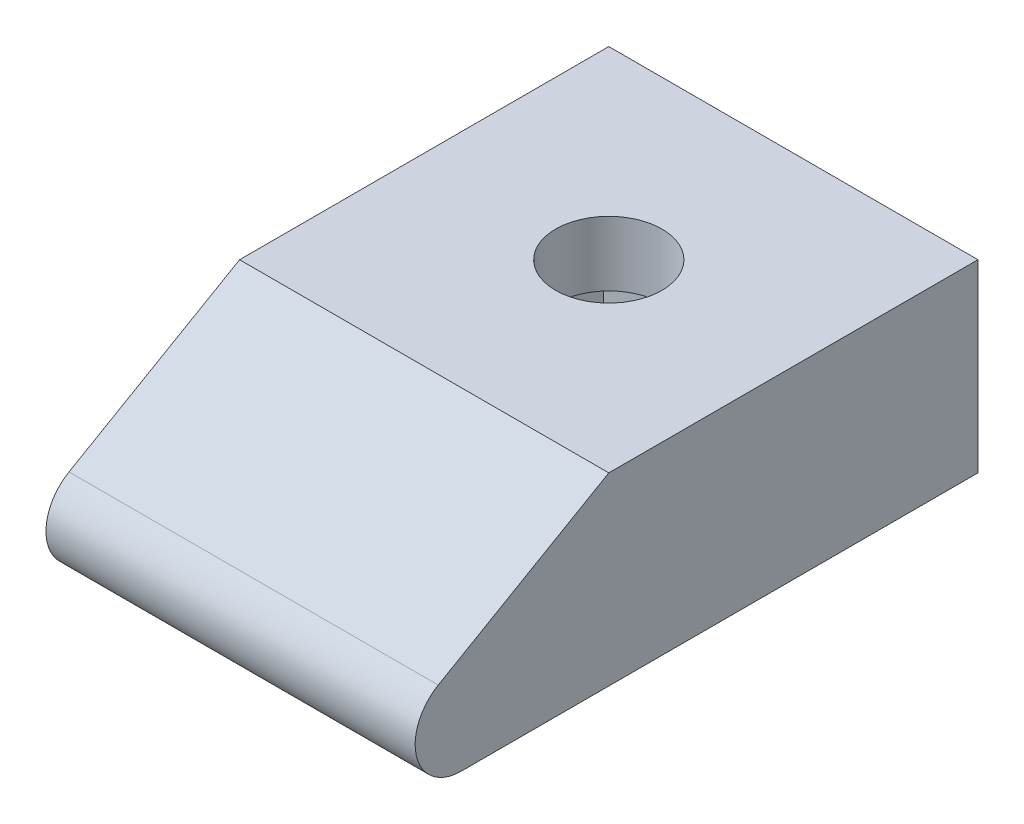
ISO-10303-21;
HEADER;
FILE_DESCRIPTION(('STEP AP214'),'2;1');
FILE_NAME('part.step','',(''),(''),'','','');
FILE_SCHEMA(('AUTOMOTIVE_DESIGN { 1 0 10303 214 1 1 1 1 }'));
ENDSEC;
DATA;
#1=APPLICATION_CONTEXT('core data for automotive mechanical design processes');
#2=APPLICATION_PROTOCOL_DEFINITION('international standard','automotive_design',2000,#1);
#3=PRODUCT_CONTEXT('',#1,'mechanical');
#4=PRODUCT('Part','Part','',(#3));
#5=PRODUCT_RELATED_PRODUCT_CATEGORY('part','',(#4));
#6=PRODUCT_DEFINITION_FORMATION('','',#4);
#7=PRODUCT_DEFINITION_CONTEXT('part definition',#1,'design');
#8=PRODUCT_DEFINITION('design','',#6,#7);
#9=PRODUCT_DEFINITION_SHAPE('','',#8);
#10=(LENGTH_UNIT() NAMED_UNIT(*) SI_UNIT(.MILLI.,.METRE.));
#11=(NAMED_UNIT(*) PLANE_ANGLE_UNIT() SI_UNIT($,.RADIAN.));
#12=(NAMED_UNIT(*) SI_UNIT($,.STERADIAN.) SOLID_ANGLE_UNIT());
#13=UNCERTAINTY_MEASURE_WITH_UNIT(LENGTH_MEASURE(1.E-05),#10,'distance_accuracy_value','');
#14=(GEOMETRIC_REPRESENTATION_CONTEXT(3) GLOBAL_UNCERTAINTY_ASSIGNED_CONTEXT((#13)) GLOBAL_UNIT_ASSIGNED_CONTEXT((#10,
#11,#12)) REPRESENTATION_CONTEXT('',''));
#15=CARTESIAN_POINT('',(0.,0.,0.));
#16=DIRECTION('',(0.,0.,1.));
#17=DIRECTION('',(1.,0.,0.));
#18=AXIS2_PLACEMENT_3D('',#15,#16,#17);
#19=CARTESIAN_POINT('',(5.715,27.4803001016889,-19.304));
#20=DIRECTION('',(0.,0.,-1.));
#21=DIRECTION('',(-1.,0.,0.));
#22=AXIS2_PLACEMENT_3D('',#19,#20,#21);
#23=PLANE('',#22);
#24=DIRECTION('',(0.,-1.,0.));
#25=VECTOR('',#24,1.);
#26=CARTESIAN_POINT('',(5.715,27.4803001016889,-19.304));
#27=LINE('',#26,#25);
#28=CARTESIAN_POINT('',(5.715,8.255,-19.304));
#29=VERTEX_POINT('',#28);
#30=CARTESIAN_POINT('',(5.715,0.,-19.304));
#31=VERTEX_POINT('',#30);
#32=EDGE_CURVE('E406',#29,#31,#27,.T.);
#33=ORIENTED_EDGE('',*,*,#32,.T.);
#34=DIRECTION('',(1.,0.,0.));
#35=VECTOR('',#34,1.);
#36=CARTESIAN_POINT('',(5.715,0.,-19.304));
#37=LINE('',#36,#35);
#38=CARTESIAN_POINT('',(9.525,0.,-19.304));
#39=VERTEX_POINT('',#38);
#40=EDGE_CURVE('E393',#31,#39,#37,.T.);
#41=ORIENTED_EDGE('',*,*,#40,.T.);
#42=DIRECTION('',(0.,1.,0.));
#43=VECTOR('',#42,1.);
#44=CARTESIAN_POINT('',(9.525,-6.35,-19.304));
#45=LINE('',#44,#43);
#46=CARTESIAN_POINT('',(9.525,-6.35,-19.304));
#47=VERTEX_POINT('',#46);
#48=EDGE_CURVE('E285',#47,#39,#45,.T.);
#49=ORIENTED_EDGE('',*,*,#48,.F.);
#50=DIRECTION('',(-1.,0.,0.));
#51=VECTOR('',#50,1.);
#52=CARTESIAN_POINT('',(9.525,-6.35,-19.304));
#53=LINE('',#52,#51);
#54=CARTESIAN_POINT('',(15.875,-6.35,-19.304));
#55=VERTEX_POINT('',#54);
#56=EDGE_CURVE('E287',#55,#47,#53,.T.);
#57=ORIENTED_EDGE('',*,*,#56,.F.);
#58=DIRECTION('',(0.,1.,0.));
#59=VECTOR('',#58,1.);
#60=CARTESIAN_POINT('',(15.875,-6.35,-19.304));
#61=LINE('',#60,#59);
#62=CARTESIAN_POINT('',(15.875,0.,-19.304));
#63=VERTEX_POINT('',#62);
#64=EDGE_CURVE('E283',#55,#63,#61,.T.);
#65=ORIENTED_EDGE('',*,*,#64,.T.);
#66=CARTESIAN_POINT('',(19.685,0.,-19.304));
#67=VERTEX_POINT('',#66);
#68=EDGE_CURVE('E396',#63,#67,#37,.T.);
#69=ORIENTED_EDGE('',*,*,#68,.T.);
#70=DIRECTION('',(0.,-1.,0.));
#71=VECTOR('',#70,1.);
#72=CARTESIAN_POINT('',(19.685,27.4803001016889,-19.304));
#73=LINE('',#72,#71);
#74=CARTESIAN_POINT('',(19.685,8.255,-19.304));
#75=VERTEX_POINT('',#74);
#76=EDGE_CURVE('E402',#75,#67,#73,.T.);
#77=ORIENTED_EDGE('',*,*,#76,.F.);
#78=DIRECTION('',(1.,0.,0.));
#79=VECTOR('',#78,1.);
#80=CARTESIAN_POINT('',(5.715,8.255,-19.304));
#81=LINE('',#80,#79);
#82=EDGE_CURVE('E387',#29,#75,#81,.T.);
#83=ORIENTED_EDGE('',*,*,#82,.F.);
#84=EDGE_LOOP('',(#33,#41,#49,#57,#65,#69,#77,#83));
#85=FACE_BOUND('',#84,.T.);
#86=DIRECTION('',(0.,1.,0.));
#87=VECTOR('',#86,1.);
#88=CARTESIAN_POINT('',(14.2875,27.4803001016889,-19.304));
#89=LINE('',#88,#87);
#90=CARTESIAN_POINT('',(14.2875,-4.064,-19.304));
#91=VERTEX_POINT('',#90);
#92=CARTESIAN_POINT('',(14.2875,-2.4765,-19.304));
#93=VERTEX_POINT('',#92);
#94=EDGE_CURVE('E11',#91,#93,#89,.T.);
#95=ORIENTED_EDGE('',*,*,#94,.F.);
#96=DIRECTION('',(-1.,0.,0.));
#97=VECTOR('',#96,1.);
#98=CARTESIAN_POINT('',(14.2875,-4.064,-19.304));
#99=LINE('',#98,#97);
#100=CARTESIAN_POINT('',(11.1125,-4.064,-19.304));
#101=VERTEX_POINT('',#100);
#102=EDGE_CURVE('E44',#91,#101,#99,.T.);
#103=ORIENTED_EDGE('',*,*,#102,.T.);
#104=DIRECTION('',(0.,1.,0.));
#105=VECTOR('',#104,1.);
#106=CARTESIAN_POINT('',(11.1125,27.4803001016889,-19.304));
#107=LINE('',#106,#105);
#108=CARTESIAN_POINT('',(11.1125,-2.4765,-19.304));
#109=VERTEX_POINT('',#108);
#110=EDGE_CURVE('E244',#101,#109,#107,.T.);
#111=ORIENTED_EDGE('',*,*,#110,.T.);
#112=DIRECTION('',(-1.,0.,0.));
#113=VECTOR('',#112,1.);
#114=CARTESIAN_POINT('',(14.2875,-2.4765,-19.304));
#115=LINE('',#114,#113);
#116=EDGE_CURVE('E250',#109,#93,#115,.F.);
#117=ORIENTED_EDGE('',*,*,#116,.T.);
#118=EDGE_LOOP('',(#95,#103,#111,#117));
#119=FACE_BOUND('',#118,.T.);
#120=ADVANCED_FACE('F36',(#85,#119),#23,.F.);
#121=CARTESIAN_POINT('',(0.,0.,0.));
#122=DIRECTION('',(0.,-1.,0.));
#123=DIRECTION('',(0.,0.,-1.));
#124=AXIS2_PLACEMENT_3D('',#121,#122,#123);
#125=PLANE('',#124);
#126=DIRECTION('',(-1.,0.,0.));
#127=VECTOR('',#126,1.);
#128=CARTESIAN_POINT('',(22.8814497854118,0.,-23.8525536292842));
#129=LINE('',#128,#127);
#130=CARTESIAN_POINT('',(15.875,0.,-23.8525536292842));
#131=VERTEX_POINT('',#130);
#132=CARTESIAN_POINT('',(9.525,0.,-23.8525536292842));
#133=VERTEX_POINT('',#132);
#134=EDGE_CURVE('E265',#131,#133,#129,.T.);
#135=ORIENTED_EDGE('',*,*,#134,.T.);
#136=DIRECTION('',(0.,0.,-1.));
#137=VECTOR('',#136,1.);
#138=CARTESIAN_POINT('',(9.525,0.,-19.304));
#139=LINE('',#138,#137);
#140=EDGE_CURVE('E291',#39,#133,#139,.T.);
#141=ORIENTED_EDGE('',*,*,#140,.F.);
#142=ORIENTED_EDGE('',*,*,#40,.F.);
#143=DIRECTION('',(0.,0.,-1.));
#144=VECTOR('',#143,1.);
#145=CARTESIAN_POINT('',(5.715,0.,-6.096));
#146=LINE('',#145,#144);
#147=CARTESIAN_POINT('',(5.715,0.,-16.1925));
#148=VERTEX_POINT('',#147);
#149=EDGE_CURVE('E352',#148,#31,#146,.T.);
#150=ORIENTED_EDGE('',*,*,#149,.F.);
#151=DIRECTION('',(1.,0.,0.));
#152=VECTOR('',#151,1.);
#153=CARTESIAN_POINT('',(5.715,0.,-16.1925));
#154=LINE('',#153,#152);
#155=CARTESIAN_POINT('',(4.445,0.,-16.1925));
#156=VERTEX_POINT('',#155);
#157=EDGE_CURVE('E332',#156,#148,#154,.T.);
#158=ORIENTED_EDGE('',*,*,#157,.F.);
#159=DIRECTION('',(0.,0.,-1.));
#160=VECTOR('',#159,1.);
#161=CARTESIAN_POINT('',(4.445,0.,-9.2075));
#162=LINE('',#161,#160);
#163=CARTESIAN_POINT('',(4.445,0.,-9.2075));
#164=VERTEX_POINT('',#163);
#165=EDGE_CURVE('E344',#164,#156,#162,.T.);
#166=ORIENTED_EDGE('',*,*,#165,.F.);
#167=DIRECTION('',(-1.,0.,0.));
#168=VECTOR('',#167,1.);
#169=CARTESIAN_POINT('',(5.715,0.,-9.2075));
#170=LINE('',#169,#168);
#171=CARTESIAN_POINT('',(5.715,0.,-9.2075));
#172=VERTEX_POINT('',#171);
#173=EDGE_CURVE('E341',#172,#164,#170,.T.);
#174=ORIENTED_EDGE('',*,*,#173,.F.);
#175=CARTESIAN_POINT('',(5.715,0.,-6.096));
#176=VERTEX_POINT('',#175);
#177=EDGE_CURVE('E397',#176,#172,#146,.T.);
#178=ORIENTED_EDGE('',*,*,#177,.F.);
#179=DIRECTION('',(-1.,0.,0.));
#180=VECTOR('',#179,1.);
#181=CARTESIAN_POINT('',(5.715,0.,-6.096));
#182=LINE('',#181,#180);
#183=CARTESIAN_POINT('',(9.525,0.,-6.096));
#184=VERTEX_POINT('',#183);
#185=EDGE_CURVE('E388',#184,#176,#182,.T.);
#186=ORIENTED_EDGE('',*,*,#185,.F.);
#187=DIRECTION('',(0.,0.,-1.));
#188=VECTOR('',#187,1.);
#189=CARTESIAN_POINT('',(9.525,0.,-6.096));
#190=LINE('',#189,#188);
#191=CARTESIAN_POINT('',(9.525,0.,-1.54744637071581));
#192=VERTEX_POINT('',#191);
#193=EDGE_CURVE('E294',#192,#184,#190,.T.);
#194=ORIENTED_EDGE('',*,*,#193,.F.);
#195=DIRECTION('',(-1.,0.,0.));
#196=VECTOR('',#195,1.);
#197=CARTESIAN_POINT('',(22.8814497854118,0.,-1.54744637071581));
#198=LINE('',#197,#196);
#199=CARTESIAN_POINT('',(15.875,0.,-1.54744637071581));
#200=VERTEX_POINT('',#199);
#201=EDGE_CURVE('E278',#200,#192,#198,.T.);
#202=ORIENTED_EDGE('',*,*,#201,.F.);
#203=DIRECTION('',(0.,0.,1.));
#204=VECTOR('',#203,1.);
#205=CARTESIAN_POINT('',(15.875,0.,-6.096));
#206=LINE('',#205,#204);
#207=CARTESIAN_POINT('',(15.875,0.,-6.096));
#208=VERTEX_POINT('',#207);
#209=EDGE_CURVE('E307',#208,#200,#206,.T.);
#210=ORIENTED_EDGE('',*,*,#209,.F.);
#211=CARTESIAN_POINT('',(19.685,0.,-6.096));
#212=VERTEX_POINT('',#211);
#213=EDGE_CURVE('E384',#212,#208,#182,.T.);
#214=ORIENTED_EDGE('',*,*,#213,.F.);
#215=DIRECTION('',(0.,0.,1.));
#216=VECTOR('',#215,1.);
#217=CARTESIAN_POINT('',(19.685,0.,-6.096));
#218=LINE('',#217,#216);
#219=CARTESIAN_POINT('',(19.685,0.,-9.2075));
#220=VERTEX_POINT('',#219);
#221=EDGE_CURVE('E392',#220,#212,#218,.T.);
#222=ORIENTED_EDGE('',*,*,#221,.F.);
#223=DIRECTION('',(-1.,0.,0.));
#224=VECTOR('',#223,1.);
#225=CARTESIAN_POINT('',(19.685,0.,-9.2075));
#226=LINE('',#225,#224);
#227=CARTESIAN_POINT('',(20.955,0.,-9.2075));
#228=VERTEX_POINT('',#227);
#229=EDGE_CURVE('E367',#228,#220,#226,.T.);
#230=ORIENTED_EDGE('',*,*,#229,.F.);
#231=DIRECTION('',(0.,0.,1.));
#232=VECTOR('',#231,1.);
#233=CARTESIAN_POINT('',(20.955,0.,-9.2075));
#234=LINE('',#233,#232);
#235=CARTESIAN_POINT('',(20.955,0.,-16.1925));
#236=VERTEX_POINT('',#235);
#237=EDGE_CURVE('E369',#236,#228,#234,.T.);
#238=ORIENTED_EDGE('',*,*,#237,.F.);
#239=DIRECTION('',(1.,0.,0.));
#240=VECTOR('',#239,1.);
#241=CARTESIAN_POINT('',(19.685,0.,-16.1925));
#242=LINE('',#241,#240);
#243=CARTESIAN_POINT('',(19.685,0.,-16.1925));
#244=VERTEX_POINT('',#243);
#245=EDGE_CURVE('E345',#244,#236,#242,.T.);
#246=ORIENTED_EDGE('',*,*,#245,.F.);
#247=EDGE_CURVE('E389',#67,#244,#218,.T.);
#248=ORIENTED_EDGE('',*,*,#247,.F.);
#249=ORIENTED_EDGE('',*,*,#68,.F.);
#250=DIRECTION('',(0.,0.,1.));
#251=VECTOR('',#250,1.);
#252=CARTESIAN_POINT('',(15.875,0.,-19.304));
#253=LINE('',#252,#251);
#254=EDGE_CURVE('E288',#131,#63,#253,.T.);
#255=ORIENTED_EDGE('',*,*,#254,.F.);
#256=EDGE_LOOP('',(#135,#141,#142,#150,#158,#166,#174,#178,#186,#194,#202,#210,#214,#222,#230,
#238,#246,#248,#249,#255));
#257=FACE_BOUND('',#256,.T.);
#258=DIRECTION('',(0.,0.,-1.));
#259=VECTOR('',#258,1.);
#260=CARTESIAN_POINT('',(25.4,0.,0.));
#261=LINE('',#260,#259);
#262=CARTESIAN_POINT('',(25.4,0.,10.1477839420937));
#263=VERTEX_POINT('',#262);
#264=CARTESIAN_POINT('',(25.4,0.,-25.4));
#265=VERTEX_POINT('',#264);
#266=EDGE_CURVE('E443',#263,#265,#261,.T.);
#267=ORIENTED_EDGE('',*,*,#266,.F.);
#268=DIRECTION('',(-1.,0.,0.));
#269=VECTOR('',#268,1.);
#270=CARTESIAN_POINT('',(0.,0.,10.1477839420937));
#271=LINE('',#270,#269);
#272=CARTESIAN_POINT('',(0.,0.,10.1477839420937));
#273=VERTEX_POINT('',#272);
#274=EDGE_CURVE('E451',#263,#273,#271,.T.);
#275=ORIENTED_EDGE('',*,*,#274,.T.);
#276=DIRECTION('',(0.,0.,1.));
#277=VECTOR('',#276,1.);
#278=CARTESIAN_POINT('',(0.,0.,0.));
#279=LINE('',#278,#277);
#280=CARTESIAN_POINT('',(0.,0.,-25.4));
#281=VERTEX_POINT('',#280);
#282=EDGE_CURVE('E429',#281,#273,#279,.T.);
#283=ORIENTED_EDGE('',*,*,#282,.F.);
#284=DIRECTION('',(-1.,0.,0.));
#285=VECTOR('',#284,1.);
#286=CARTESIAN_POINT('',(0.,0.,-25.4));
#287=LINE('',#286,#285);
#288=EDGE_CURVE('E434',#265,#281,#287,.T.);
#289=ORIENTED_EDGE('',*,*,#288,.F.);
#290=EDGE_LOOP('',(#267,#275,#283,#289));
#291=FACE_BOUND('',#290,.T.);
#292=ADVANCED_FACE('F470',(#257,#291),#125,.T.);
#293=CARTESIAN_POINT('',(0.,12.7,0.));
#294=DIRECTION('',(1.,0.,0.));
#295=DIRECTION('',(0.,0.,-1.));
#296=AXIS2_PLACEMENT_3D('',#293,#294,#295);
#297=PLANE('',#296);
#298=ORIENTED_EDGE('',*,*,#282,.T.);
#299=CARTESIAN_POINT('',(0.,3.175,10.1477839420937));
#300=DIRECTION('',(1.,0.,0.));
#301=DIRECTION('',(0.,0.,-1.));
#302=AXIS2_PLACEMENT_3D('',#299,#300,#301);
#303=CIRCLE('',#302,3.175);
#304=CARTESIAN_POINT('',(0.,5.9246306570156,11.7352839420937));
#305=VERTEX_POINT('',#304);
#306=EDGE_CURVE('E454',#273,#305,#303,.F.);
#307=ORIENTED_EDGE('',*,*,#306,.T.);
#308=DIRECTION('',(0.,0.499999999999995,-0.866025403784442));
#309=VECTOR('',#308,1.);
#310=CARTESIAN_POINT('',(0.,0.,21.997045256125));
#311=LINE('',#310,#309);
#312=CARTESIAN_POINT('',(0.,12.7,0.));
#313=VERTEX_POINT('',#312);
#314=EDGE_CURVE('E322',#305,#313,#311,.T.);
#315=ORIENTED_EDGE('',*,*,#314,.T.);
#316=DIRECTION('',(0.,0.,1.));
#317=VECTOR('',#316,1.);
#318=CARTESIAN_POINT('',(0.,12.7,0.));
#319=LINE('',#318,#317);
#320=CARTESIAN_POINT('',(0.,12.7,-25.4));
#321=VERTEX_POINT('',#320);
#322=EDGE_CURVE('E430',#321,#313,#319,.T.);
#323=ORIENTED_EDGE('',*,*,#322,.F.);
#324=DIRECTION('',(0.,-1.,0.));
#325=VECTOR('',#324,1.);
#326=CARTESIAN_POINT('',(0.,12.7,-25.4));
#327=LINE('',#326,#325);
#328=EDGE_CURVE('E440',#321,#281,#327,.T.);
#329=ORIENTED_EDGE('',*,*,#328,.T.);
#330=EDGE_LOOP('',(#298,#307,#315,#323,#329));
#331=FACE_BOUND('',#330,.T.);
#332=ADVANCED_FACE('F474',(#331),#297,.F.);
#333=CARTESIAN_POINT('',(25.4,12.7,0.));
#334=DIRECTION('',(-1.,0.,0.));
#335=DIRECTION('',(0.,0.,1.));
#336=AXIS2_PLACEMENT_3D('',#333,#334,#335);
#337=PLANE('',#336);
#338=DIRECTION('',(0.,-0.499999999999995,0.866025403784442));
#339=VECTOR('',#338,1.);
#340=CARTESIAN_POINT('',(25.4,0.,21.997045256125));
#341=LINE('',#340,#339);
#342=CARTESIAN_POINT('',(25.4,12.7,0.));
#343=VERTEX_POINT('',#342);
#344=CARTESIAN_POINT('',(25.4,5.9246306570156,11.7352839420937));
#345=VERTEX_POINT('',#344);
#346=EDGE_CURVE('E323',#343,#345,#341,.T.);
#347=ORIENTED_EDGE('',*,*,#346,.T.);
#348=CARTESIAN_POINT('',(25.4,3.175,10.1477839420937));
#349=DIRECTION('',(-1.,0.,0.));
#350=DIRECTION('',(0.,0.,1.));
#351=AXIS2_PLACEMENT_3D('',#348,#349,#350);
#352=CIRCLE('',#351,3.175);
#353=EDGE_CURVE('E230',#345,#263,#352,.F.);
#354=ORIENTED_EDGE('',*,*,#353,.T.);
#355=ORIENTED_EDGE('',*,*,#266,.T.);
#356=DIRECTION('',(0.,-1.,0.));
#357=VECTOR('',#356,1.);
#358=CARTESIAN_POINT('',(25.4,12.7,-25.4));
#359=LINE('',#358,#357);
#360=CARTESIAN_POINT('',(25.4,12.7,-25.4));
#361=VERTEX_POINT('',#360);
#362=EDGE_CURVE('E448',#361,#265,#359,.T.);
#363=ORIENTED_EDGE('',*,*,#362,.F.);
#364=DIRECTION('',(0.,0.,-1.));
#365=VECTOR('',#364,1.);
#366=CARTESIAN_POINT('',(25.4,12.7,0.));
#367=LINE('',#366,#365);
#368=EDGE_CURVE('E436',#343,#361,#367,.T.);
#369=ORIENTED_EDGE('',*,*,#368,.F.);
#370=EDGE_LOOP('',(#347,#354,#355,#363,#369));
#371=FACE_BOUND('',#370,.T.);
#372=ADVANCED_FACE('F461',(#371),#337,.F.);
#373=CARTESIAN_POINT('',(0.,12.7,-25.4));
#374=DIRECTION('',(0.,0.,1.));
#375=DIRECTION('',(1.,0.,0.));
#376=AXIS2_PLACEMENT_3D('',#373,#374,#375);
#377=PLANE('',#376);
#378=ORIENTED_EDGE('',*,*,#288,.T.);
#379=ORIENTED_EDGE('',*,*,#328,.F.);
#380=DIRECTION('',(-1.,0.,0.));
#381=VECTOR('',#380,1.);
#382=CARTESIAN_POINT('',(0.,12.7,-25.4));
#383=LINE('',#382,#381);
#384=EDGE_CURVE('E438',#361,#321,#383,.T.);
#385=ORIENTED_EDGE('',*,*,#384,.F.);
#386=ORIENTED_EDGE('',*,*,#362,.T.);
#387=EDGE_LOOP('',(#378,#379,#385,#386));
#388=FACE_BOUND('',#387,.T.);
#389=ADVANCED_FACE('F484',(#388),#377,.F.);
#390=CARTESIAN_POINT('',(0.,12.7,0.));
#391=DIRECTION('',(0.,-1.,0.));
#392=DIRECTION('',(0.,0.,-1.));
#393=AXIS2_PLACEMENT_3D('',#390,#391,#392);
#394=PLANE('',#393);
#395=CARTESIAN_POINT('',(12.7,12.7,-12.7));
#396=DIRECTION('',(0.,1.,0.));
#397=DIRECTION('',(0.,0.,1.));
#398=AXIS2_PLACEMENT_3D('',#395,#396,#397);
#399=CIRCLE('',#398,3.6576);
#400=CARTESIAN_POINT('',(12.7,12.7,-9.0424));
#401=VERTEX_POINT('',#400);
#402=EDGE_CURVE('E426',#401,#401,#399,.T.);
#403=ORIENTED_EDGE('',*,*,#402,.F.);
#404=EDGE_LOOP('',(#403));
#405=FACE_BOUND('',#404,.T.);
#406=ORIENTED_EDGE('',*,*,#322,.T.);
#407=DIRECTION('',(1.,0.,0.));
#408=VECTOR('',#407,1.);
#409=CARTESIAN_POINT('',(0.,12.7,0.));
#410=LINE('',#409,#408);
#411=EDGE_CURVE('E433',#313,#343,#410,.T.);
#412=ORIENTED_EDGE('',*,*,#411,.T.);
#413=ORIENTED_EDGE('',*,*,#368,.T.);
#414=ORIENTED_EDGE('',*,*,#384,.T.);
#415=EDGE_LOOP('',(#406,#412,#413,#414));
#416=FACE_BOUND('',#415,.T.);
#417=ADVANCED_FACE('F480',(#405,#416),#394,.F.);
#418=CARTESIAN_POINT('',(12.7,8.255,-12.7));
#419=DIRECTION('',(0.,1.,0.));
#420=DIRECTION('',(0.,0.,1.));
#421=AXIS2_PLACEMENT_3D('',#418,#419,#420);
#422=CYLINDRICAL_SURFACE('',#421,3.6576);
#423=CARTESIAN_POINT('',(12.7,8.255,-12.7));
#424=DIRECTION('',(0.,1.,0.));
#425=DIRECTION('',(0.,0.,1.));
#426=AXIS2_PLACEMENT_3D('',#423,#424,#425);
#427=CIRCLE('',#426,3.6576);
#428=CARTESIAN_POINT('',(12.7,8.255,-9.0424));
#429=VERTEX_POINT('',#428);
#430=EDGE_CURVE('E423',#429,#429,#427,.T.);
#431=ORIENTED_EDGE('',*,*,#430,.F.);
#432=EDGE_LOOP('',(#431));
#433=FACE_BOUND('',#432,.T.);
#434=ORIENTED_EDGE('',*,*,#402,.T.);
#435=EDGE_LOOP('',(#434));
#436=FACE_BOUND('',#435,.T.);
#437=ADVANCED_FACE('F491',(#433,#436),#422,.F.);
#438=CARTESIAN_POINT('',(12.7,8.255,-12.7));
#439=DIRECTION('',(0.,1.,0.));
#440=DIRECTION('',(0.,0.,1.));
#441=AXIS2_PLACEMENT_3D('',#438,#439,#440);
#442=PLANE('',#441);
#443=ORIENTED_EDGE('',*,*,#430,.T.);
#444=EDGE_LOOP('',(#443));
#445=FACE_BOUND('',#444,.T.);
#446=DIRECTION('',(0.,0.,-1.));
#447=VECTOR('',#446,1.);
#448=CARTESIAN_POINT('',(5.715,8.255,-6.096));
#449=LINE('',#448,#447);
#450=CARTESIAN_POINT('',(5.715,8.255,-6.096));
#451=VERTEX_POINT('',#450);
#452=EDGE_CURVE('E403',#451,#29,#449,.T.);
#453=ORIENTED_EDGE('',*,*,#452,.T.);
#454=ORIENTED_EDGE('',*,*,#82,.T.);
#455=DIRECTION('',(0.,0.,1.));
#456=VECTOR('',#455,1.);
#457=CARTESIAN_POINT('',(19.685,8.255,-6.096));
#458=LINE('',#457,#456);
#459=CARTESIAN_POINT('',(19.685,8.255,-6.096));
#460=VERTEX_POINT('',#459);
#461=EDGE_CURVE('E412',#75,#460,#458,.T.);
#462=ORIENTED_EDGE('',*,*,#461,.T.);
#463=DIRECTION('',(-1.,0.,0.));
#464=VECTOR('',#463,1.);
#465=CARTESIAN_POINT('',(5.715,8.255,-6.096));
#466=LINE('',#465,#464);
#467=EDGE_CURVE('E408',#460,#451,#466,.T.);
#468=ORIENTED_EDGE('',*,*,#467,.T.);
#469=EDGE_LOOP('',(#453,#454,#462,#468));
#470=FACE_BOUND('',#469,.T.);
#471=ADVANCED_FACE('F509',(#445,#470),#442,.F.);
#472=CARTESIAN_POINT('',(19.685,27.4803001016889,-6.096));
#473=DIRECTION('',(1.,0.,0.));
#474=DIRECTION('',(0.,0.,-1.));
#475=AXIS2_PLACEMENT_3D('',#472,#473,#474);
#476=PLANE('',#475);
#477=DIRECTION('',(0.,0.,-1.));
#478=VECTOR('',#477,1.);
#479=CARTESIAN_POINT('',(19.685,3.175,-9.2075));
#480=LINE('',#479,#478);
#481=CARTESIAN_POINT('',(19.685,3.175,-9.2075));
#482=VERTEX_POINT('',#481);
#483=CARTESIAN_POINT('',(19.685,3.175,-16.1925));
#484=VERTEX_POINT('',#483);
#485=EDGE_CURVE('E370',#482,#484,#480,.T.);
#486=ORIENTED_EDGE('',*,*,#485,.F.);
#487=DIRECTION('',(0.,-1.,0.));
#488=VECTOR('',#487,1.);
#489=CARTESIAN_POINT('',(19.685,3.175,-9.2075));
#490=LINE('',#489,#488);
#491=EDGE_CURVE('E326',#482,#220,#490,.T.);
#492=ORIENTED_EDGE('',*,*,#491,.T.);
#493=ORIENTED_EDGE('',*,*,#221,.T.);
#494=DIRECTION('',(0.,-1.,0.));
#495=VECTOR('',#494,1.);
#496=CARTESIAN_POINT('',(19.685,27.4803001016889,-6.096));
#497=LINE('',#496,#495);
#498=EDGE_CURVE('E411',#460,#212,#497,.T.);
#499=ORIENTED_EDGE('',*,*,#498,.F.);
#500=ORIENTED_EDGE('',*,*,#461,.F.);
#501=ORIENTED_EDGE('',*,*,#76,.T.);
#502=ORIENTED_EDGE('',*,*,#247,.T.);
#503=DIRECTION('',(0.,-1.,0.));
#504=VECTOR('',#503,1.);
#505=CARTESIAN_POINT('',(19.685,3.175,-16.1925));
#506=LINE('',#505,#504);
#507=EDGE_CURVE('E358',#484,#244,#506,.T.);
#508=ORIENTED_EDGE('',*,*,#507,.F.);
#509=EDGE_LOOP('',(#486,#492,#493,#499,#500,#501,#502,#508));
#510=FACE_BOUND('',#509,.T.);
#511=ADVANCED_FACE('F507',(#510),#476,.F.);
#512=CARTESIAN_POINT('',(5.715,27.4803001016889,-6.096));
#513=DIRECTION('',(0.,0.,1.));
#514=DIRECTION('',(1.,0.,0.));
#515=AXIS2_PLACEMENT_3D('',#512,#513,#514);
#516=PLANE('',#515);
#517=DIRECTION('',(-1.,0.,0.));
#518=VECTOR('',#517,1.);
#519=CARTESIAN_POINT('',(14.2875,-4.064,-6.096));
#520=LINE('',#519,#518);
#521=CARTESIAN_POINT('',(11.1125,-4.064,-6.096));
#522=VERTEX_POINT('',#521);
#523=CARTESIAN_POINT('',(14.2875,-4.064,-6.096));
#524=VERTEX_POINT('',#523);
#525=EDGE_CURVE('E229',#522,#524,#520,.F.);
#526=ORIENTED_EDGE('',*,*,#525,.T.);
#527=DIRECTION('',(0.,1.,0.));
#528=VECTOR('',#527,1.);
#529=CARTESIAN_POINT('',(14.2875,27.4803001016889,-6.096));
#530=LINE('',#529,#528);
#531=CARTESIAN_POINT('',(14.2875,-2.4765,-6.096));
#532=VERTEX_POINT('',#531);
#533=EDGE_CURVE('E242',#524,#532,#530,.T.);
#534=ORIENTED_EDGE('',*,*,#533,.T.);
#535=DIRECTION('',(-1.,0.,0.));
#536=VECTOR('',#535,1.);
#537=CARTESIAN_POINT('',(14.2875,-2.4765,-6.096));
#538=LINE('',#537,#536);
#539=CARTESIAN_POINT('',(11.1125,-2.4765,-6.096));
#540=VERTEX_POINT('',#539);
#541=EDGE_CURVE('E235',#532,#540,#538,.T.);
#542=ORIENTED_EDGE('',*,*,#541,.T.);
#543=DIRECTION('',(0.,1.,0.));
#544=VECTOR('',#543,1.);
#545=CARTESIAN_POINT('',(11.1125,27.4803001016889,-6.096));
#546=LINE('',#545,#544);
#547=EDGE_CURVE('E224',#522,#540,#546,.T.);
#548=ORIENTED_EDGE('',*,*,#547,.F.);
#549=EDGE_LOOP('',(#526,#534,#542,#548));
#550=FACE_BOUND('',#549,.T.);
#551=ORIENTED_EDGE('',*,*,#498,.T.);
#552=ORIENTED_EDGE('',*,*,#213,.T.);
#553=DIRECTION('',(0.,1.,0.));
#554=VECTOR('',#553,1.);
#555=CARTESIAN_POINT('',(15.875,-6.35,-6.096));
#556=LINE('',#555,#554);
#557=CARTESIAN_POINT('',(15.875,-6.35,-6.096));
#558=VERTEX_POINT('',#557);
#559=EDGE_CURVE('E315',#558,#208,#556,.T.);
#560=ORIENTED_EDGE('',*,*,#559,.F.);
#561=DIRECTION('',(1.,0.,0.));
#562=VECTOR('',#561,1.);
#563=CARTESIAN_POINT('',(9.525,-6.35,-6.096));
#564=LINE('',#563,#562);
#565=CARTESIAN_POINT('',(9.525,-6.35,-6.096));
#566=VERTEX_POINT('',#565);
#567=EDGE_CURVE('E306',#566,#558,#564,.T.);
#568=ORIENTED_EDGE('',*,*,#567,.F.);
#569=DIRECTION('',(0.,1.,0.));
#570=VECTOR('',#569,1.);
#571=CARTESIAN_POINT('',(9.525,-6.35,-6.096));
#572=LINE('',#571,#570);
#573=EDGE_CURVE('E319',#566,#184,#572,.T.);
#574=ORIENTED_EDGE('',*,*,#573,.T.);
#575=ORIENTED_EDGE('',*,*,#185,.T.);
#576=DIRECTION('',(0.,-1.,0.));
#577=VECTOR('',#576,1.);
#578=CARTESIAN_POINT('',(5.715,27.4803001016889,-6.096));
#579=LINE('',#578,#577);
#580=EDGE_CURVE('E407',#451,#176,#579,.T.);
#581=ORIENTED_EDGE('',*,*,#580,.F.);
#582=ORIENTED_EDGE('',*,*,#467,.F.);
#583=EDGE_LOOP('',(#551,#552,#560,#568,#574,#575,#581,#582));
#584=FACE_BOUND('',#583,.T.);
#585=ADVANCED_FACE('F240',(#550,#584),#516,.F.);
#586=CARTESIAN_POINT('',(5.715,27.4803001016889,-6.096));
#587=DIRECTION('',(-1.,0.,0.));
#588=DIRECTION('',(0.,0.,1.));
#589=AXIS2_PLACEMENT_3D('',#586,#587,#588);
#590=PLANE('',#589);
#591=DIRECTION('',(0.,0.,1.));
#592=VECTOR('',#591,1.);
#593=CARTESIAN_POINT('',(5.715,3.175,-9.2075));
#594=LINE('',#593,#592);
#595=CARTESIAN_POINT('',(5.715,3.175,-16.1925));
#596=VERTEX_POINT('',#595);
#597=CARTESIAN_POINT('',(5.715,3.175,-9.2075));
#598=VERTEX_POINT('',#597);
#599=EDGE_CURVE('E328',#596,#598,#594,.T.);
#600=ORIENTED_EDGE('',*,*,#599,.F.);
#601=DIRECTION('',(0.,-1.,0.));
#602=VECTOR('',#601,1.);
#603=CARTESIAN_POINT('',(5.715,3.175,-16.1925));
#604=LINE('',#603,#602);
#605=EDGE_CURVE('E349',#596,#148,#604,.T.);
#606=ORIENTED_EDGE('',*,*,#605,.T.);
#607=ORIENTED_EDGE('',*,*,#149,.T.);
#608=ORIENTED_EDGE('',*,*,#32,.F.);
#609=ORIENTED_EDGE('',*,*,#452,.F.);
#610=ORIENTED_EDGE('',*,*,#580,.T.);
#611=ORIENTED_EDGE('',*,*,#177,.T.);
#612=DIRECTION('',(0.,-1.,0.));
#613=VECTOR('',#612,1.);
#614=CARTESIAN_POINT('',(5.715,3.175,-9.2075));
#615=LINE('',#614,#613);
#616=EDGE_CURVE('E340',#598,#172,#615,.T.);
#617=ORIENTED_EDGE('',*,*,#616,.F.);
#618=EDGE_LOOP('',(#600,#606,#607,#608,#609,#610,#611,#617));
#619=FACE_BOUND('',#618,.T.);
#620=ADVANCED_FACE('F525',(#619),#590,.F.);
#621=CARTESIAN_POINT('',(5.715,3.175,-16.1925));
#622=DIRECTION('',(0.,0.,-1.));
#623=DIRECTION('',(-1.,0.,0.));
#624=AXIS2_PLACEMENT_3D('',#621,#622,#623);
#625=PLANE('',#624);
#626=ORIENTED_EDGE('',*,*,#157,.T.);
#627=ORIENTED_EDGE('',*,*,#605,.F.);
#628=DIRECTION('',(1.,0.,0.));
#629=VECTOR('',#628,1.);
#630=CARTESIAN_POINT('',(5.715,3.175,-16.1925));
#631=LINE('',#630,#629);
#632=CARTESIAN_POINT('',(4.445,3.175,-16.1925));
#633=VERTEX_POINT('',#632);
#634=EDGE_CURVE('E338',#633,#596,#631,.T.);
#635=ORIENTED_EDGE('',*,*,#634,.F.);
#636=DIRECTION('',(0.,-1.,0.));
#637=VECTOR('',#636,1.);
#638=CARTESIAN_POINT('',(4.445,3.175,-16.1925));
#639=LINE('',#638,#637);
#640=EDGE_CURVE('E353',#633,#156,#639,.T.);
#641=ORIENTED_EDGE('',*,*,#640,.T.);
#642=EDGE_LOOP('',(#626,#627,#635,#641));
#643=FACE_BOUND('',#642,.T.);
#644=ADVANCED_FACE('F581',(#643),#625,.F.);
#645=CARTESIAN_POINT('',(4.445,3.175,-9.2075));
#646=DIRECTION('',(-1.,0.,0.));
#647=DIRECTION('',(0.,0.,1.));
#648=AXIS2_PLACEMENT_3D('',#645,#646,#647);
#649=PLANE('',#648);
#650=ORIENTED_EDGE('',*,*,#165,.T.);
#651=ORIENTED_EDGE('',*,*,#640,.F.);
#652=DIRECTION('',(0.,0.,-1.));
#653=VECTOR('',#652,1.);
#654=CARTESIAN_POINT('',(4.445,3.175,-9.2075));
#655=LINE('',#654,#653);
#656=CARTESIAN_POINT('',(4.445,3.175,-9.2075));
#657=VERTEX_POINT('',#656);
#658=EDGE_CURVE('E335',#657,#633,#655,.T.);
#659=ORIENTED_EDGE('',*,*,#658,.F.);
#660=DIRECTION('',(0.,-1.,0.));
#661=VECTOR('',#660,1.);
#662=CARTESIAN_POINT('',(4.445,3.175,-9.2075));
#663=LINE('',#662,#661);
#664=EDGE_CURVE('E355',#657,#164,#663,.T.);
#665=ORIENTED_EDGE('',*,*,#664,.T.);
#666=EDGE_LOOP('',(#650,#651,#659,#665));
#667=FACE_BOUND('',#666,.T.);
#668=ADVANCED_FACE('F583',(#667),#649,.F.);
#669=CARTESIAN_POINT('',(5.715,3.175,-9.2075));
#670=DIRECTION('',(0.,0.,1.));
#671=DIRECTION('',(1.,0.,0.));
#672=AXIS2_PLACEMENT_3D('',#669,#670,#671);
#673=PLANE('',#672);
#674=ORIENTED_EDGE('',*,*,#173,.T.);
#675=ORIENTED_EDGE('',*,*,#664,.F.);
#676=DIRECTION('',(-1.,0.,0.));
#677=VECTOR('',#676,1.);
#678=CARTESIAN_POINT('',(5.715,3.175,-9.2075));
#679=LINE('',#678,#677);
#680=EDGE_CURVE('E331',#598,#657,#679,.T.);
#681=ORIENTED_EDGE('',*,*,#680,.F.);
#682=ORIENTED_EDGE('',*,*,#616,.T.);
#683=EDGE_LOOP('',(#674,#675,#681,#682));
#684=FACE_BOUND('',#683,.T.);
#685=ADVANCED_FACE('F574',(#684),#673,.F.);
#686=CARTESIAN_POINT('',(0.,3.175,0.));
#687=DIRECTION('',(0.,1.,0.));
#688=DIRECTION('',(0.,0.,1.));
#689=AXIS2_PLACEMENT_3D('',#686,#687,#688);
#690=PLANE('',#689);
#691=ORIENTED_EDGE('',*,*,#599,.T.);
#692=ORIENTED_EDGE('',*,*,#680,.T.);
#693=ORIENTED_EDGE('',*,*,#658,.T.);
#694=ORIENTED_EDGE('',*,*,#634,.T.);
#695=EDGE_LOOP('',(#691,#692,#693,#694));
#696=FACE_BOUND('',#695,.T.);
#697=ADVANCED_FACE('F578',(#696),#690,.F.);
#698=CARTESIAN_POINT('',(19.685,3.175,-9.2075));
#699=DIRECTION('',(0.,0.,1.));
#700=DIRECTION('',(1.,0.,0.));
#701=AXIS2_PLACEMENT_3D('',#698,#699,#700);
#702=PLANE('',#701);
#703=ORIENTED_EDGE('',*,*,#229,.T.);
#704=ORIENTED_EDGE('',*,*,#491,.F.);
#705=DIRECTION('',(-1.,0.,0.));
#706=VECTOR('',#705,1.);
#707=CARTESIAN_POINT('',(19.685,3.175,-9.2075));
#708=LINE('',#707,#706);
#709=CARTESIAN_POINT('',(20.955,3.175,-9.2075));
#710=VERTEX_POINT('',#709);
#711=EDGE_CURVE('E360',#710,#482,#708,.T.);
#712=ORIENTED_EDGE('',*,*,#711,.F.);
#713=DIRECTION('',(0.,-1.,0.));
#714=VECTOR('',#713,1.);
#715=CARTESIAN_POINT('',(20.955,3.175,-9.2075));
#716=LINE('',#715,#714);
#717=EDGE_CURVE('E363',#710,#228,#716,.T.);
#718=ORIENTED_EDGE('',*,*,#717,.T.);
#719=EDGE_LOOP('',(#703,#704,#712,#718));
#720=FACE_BOUND('',#719,.T.);
#721=ADVANCED_FACE('F564',(#720),#702,.F.);
#722=CARTESIAN_POINT('',(20.955,3.175,-9.2075));
#723=DIRECTION('',(1.,0.,0.));
#724=DIRECTION('',(0.,0.,-1.));
#725=AXIS2_PLACEMENT_3D('',#722,#723,#724);
#726=PLANE('',#725);
#727=ORIENTED_EDGE('',*,*,#237,.T.);
#728=ORIENTED_EDGE('',*,*,#717,.F.);
#729=DIRECTION('',(0.,0.,1.));
#730=VECTOR('',#729,1.);
#731=CARTESIAN_POINT('',(20.955,3.175,-9.2075));
#732=LINE('',#731,#730);
#733=CARTESIAN_POINT('',(20.955,3.175,-16.1925));
#734=VERTEX_POINT('',#733);
#735=EDGE_CURVE('E376',#734,#710,#732,.T.);
#736=ORIENTED_EDGE('',*,*,#735,.F.);
#737=DIRECTION('',(0.,-1.,0.));
#738=VECTOR('',#737,1.);
#739=CARTESIAN_POINT('',(20.955,3.175,-16.1925));
#740=LINE('',#739,#738);
#741=EDGE_CURVE('E361',#734,#236,#740,.T.);
#742=ORIENTED_EDGE('',*,*,#741,.T.);
#743=EDGE_LOOP('',(#727,#728,#736,#742));
#744=FACE_BOUND('',#743,.T.);
#745=ADVANCED_FACE('F596',(#744),#726,.F.);
#746=CARTESIAN_POINT('',(19.685,3.175,-16.1925));
#747=DIRECTION('',(0.,0.,-1.));
#748=DIRECTION('',(-1.,0.,0.));
#749=AXIS2_PLACEMENT_3D('',#746,#747,#748);
#750=PLANE('',#749);
#751=ORIENTED_EDGE('',*,*,#245,.T.);
#752=ORIENTED_EDGE('',*,*,#741,.F.);
#753=DIRECTION('',(1.,0.,0.));
#754=VECTOR('',#753,1.);
#755=CARTESIAN_POINT('',(19.685,3.175,-16.1925));
#756=LINE('',#755,#754);
#757=EDGE_CURVE('E379',#484,#734,#756,.T.);
#758=ORIENTED_EDGE('',*,*,#757,.F.);
#759=ORIENTED_EDGE('',*,*,#507,.T.);
#760=EDGE_LOOP('',(#751,#752,#758,#759));
#761=FACE_BOUND('',#760,.T.);
#762=ADVANCED_FACE('F556',(#761),#750,.F.);
#763=CARTESIAN_POINT('',(0.,3.175,0.));
#764=DIRECTION('',(0.,-1.,0.));
#765=DIRECTION('',(0.,0.,-1.));
#766=AXIS2_PLACEMENT_3D('',#763,#764,#765);
#767=PLANE('',#766);
#768=ORIENTED_EDGE('',*,*,#485,.T.);
#769=ORIENTED_EDGE('',*,*,#757,.T.);
#770=ORIENTED_EDGE('',*,*,#735,.T.);
#771=ORIENTED_EDGE('',*,*,#711,.T.);
#772=EDGE_LOOP('',(#768,#769,#770,#771));
#773=FACE_BOUND('',#772,.T.);
#774=ADVANCED_FACE('F561',(#773),#767,.T.);
#775=CARTESIAN_POINT('',(50.8000000000003,0.,21.997045256125));
#776=DIRECTION('',(0.,0.866025403784442,0.499999999999995));
#777=DIRECTION('',(0.,-0.499999999999995,0.866025403784442));
#778=AXIS2_PLACEMENT_3D('',#775,#776,#777);
#779=PLANE('',#778);
#780=ORIENTED_EDGE('',*,*,#314,.F.);
#781=DIRECTION('',(-1.,0.,0.));
#782=VECTOR('',#781,1.);
#783=CARTESIAN_POINT('',(50.8000000000003,5.9246306570156,11.7352839420937));
#784=LINE('',#783,#782);
#785=EDGE_CURVE('E456',#305,#345,#784,.F.);
#786=ORIENTED_EDGE('',*,*,#785,.T.);
#787=ORIENTED_EDGE('',*,*,#346,.F.);
#788=ORIENTED_EDGE('',*,*,#411,.F.);
#789=EDGE_LOOP('',(#780,#786,#787,#788));
#790=FACE_BOUND('',#789,.T.);
#791=ADVANCED_FACE('F478',(#790),#779,.T.);
#792=CARTESIAN_POINT('',(0.,3.175,10.1477839420937));
#793=DIRECTION('',(-1.,0.,0.));
#794=DIRECTION('',(0.,0.,1.));
#795=AXIS2_PLACEMENT_3D('',#792,#793,#794);
#796=CYLINDRICAL_SURFACE('',#795,3.175);
#797=ORIENTED_EDGE('',*,*,#353,.F.);
#798=ORIENTED_EDGE('',*,*,#785,.F.);
#799=ORIENTED_EDGE('',*,*,#306,.F.);
#800=ORIENTED_EDGE('',*,*,#274,.F.);
#801=EDGE_LOOP('',(#797,#798,#799,#800));
#802=FACE_BOUND('',#801,.T.);
#803=ADVANCED_FACE('F38',(#802),#796,.T.);
#804=CARTESIAN_POINT('',(9.525,-6.35,-6.096));
#805=DIRECTION('',(1.,0.,0.));
#806=DIRECTION('',(0.,0.,-1.));
#807=AXIS2_PLACEMENT_3D('',#804,#805,#806);
#808=PLANE('',#807);
#809=ORIENTED_EDGE('',*,*,#193,.T.);
#810=ORIENTED_EDGE('',*,*,#573,.F.);
#811=DIRECTION('',(0.,0.,-1.));
#812=VECTOR('',#811,1.);
#813=CARTESIAN_POINT('',(9.525,-6.35,-6.096));
#814=LINE('',#813,#812);
#815=CARTESIAN_POINT('',(9.525,-6.35,-4.5085));
#816=VERTEX_POINT('',#815);
#817=EDGE_CURVE('E303',#816,#566,#814,.T.);
#818=ORIENTED_EDGE('',*,*,#817,.F.);
#819=DIRECTION('',(0.,0.906307787036652,0.422618261740694));
#820=VECTOR('',#819,1.);
#821=CARTESIAN_POINT('',(9.525,-6.35,-4.5085));
#822=LINE('',#821,#820);
#823=EDGE_CURVE('E274',#816,#192,#822,.T.);
#824=ORIENTED_EDGE('',*,*,#823,.T.);
#825=EDGE_LOOP('',(#809,#810,#818,#824));
#826=FACE_BOUND('',#825,.T.);
#827=ADVANCED_FACE('F705',(#826),#808,.F.);
#828=CARTESIAN_POINT('',(15.875,-6.35,-6.096));
#829=DIRECTION('',(-1.,0.,0.));
#830=DIRECTION('',(0.,0.,1.));
#831=AXIS2_PLACEMENT_3D('',#828,#829,#830);
#832=PLANE('',#831);
#833=ORIENTED_EDGE('',*,*,#209,.T.);
#834=DIRECTION('',(0.,-0.906307787036652,-0.422618261740694));
#835=VECTOR('',#834,1.);
#836=CARTESIAN_POINT('',(15.875,-6.35,-4.5085));
#837=LINE('',#836,#835);
#838=CARTESIAN_POINT('',(15.875,-6.35,-4.5085));
#839=VERTEX_POINT('',#838);
#840=EDGE_CURVE('E281',#200,#839,#837,.T.);
#841=ORIENTED_EDGE('',*,*,#840,.T.);
#842=DIRECTION('',(0.,0.,1.));
#843=VECTOR('',#842,1.);
#844=CARTESIAN_POINT('',(15.875,-6.35,-6.096));
#845=LINE('',#844,#843);
#846=EDGE_CURVE('E309',#558,#839,#845,.T.);
#847=ORIENTED_EDGE('',*,*,#846,.F.);
#848=ORIENTED_EDGE('',*,*,#559,.T.);
#849=EDGE_LOOP('',(#833,#841,#847,#848));
#850=FACE_BOUND('',#849,.T.);
#851=ADVANCED_FACE('F723',(#850),#832,.F.);
#852=CARTESIAN_POINT('',(0.,-6.35,0.));
#853=DIRECTION('',(0.,1.,0.));
#854=DIRECTION('',(0.,0.,1.));
#855=AXIS2_PLACEMENT_3D('',#852,#853,#854);
#856=PLANE('',#855);
#857=ORIENTED_EDGE('',*,*,#817,.T.);
#858=ORIENTED_EDGE('',*,*,#567,.T.);
#859=ORIENTED_EDGE('',*,*,#846,.T.);
#860=DIRECTION('',(-1.,0.,0.));
#861=VECTOR('',#860,1.);
#862=CARTESIAN_POINT('',(9.525,-6.35,-4.5085));
#863=LINE('',#862,#861);
#864=EDGE_CURVE('E312',#839,#816,#863,.T.);
#865=ORIENTED_EDGE('',*,*,#864,.T.);
#866=EDGE_LOOP('',(#857,#858,#859,#865));
#867=FACE_BOUND('',#866,.T.);
#868=ADVANCED_FACE('F734',(#867),#856,.F.);
#869=CARTESIAN_POINT('',(9.525,-6.35,-19.304));
#870=DIRECTION('',(1.,0.,0.));
#871=DIRECTION('',(0.,0.,-1.));
#872=AXIS2_PLACEMENT_3D('',#869,#870,#871);
#873=PLANE('',#872);
#874=ORIENTED_EDGE('',*,*,#140,.T.);
#875=DIRECTION('',(0.,-0.906307787036653,0.422618261740694));
#876=VECTOR('',#875,1.);
#877=CARTESIAN_POINT('',(9.525,-6.35,-20.8915));
#878=LINE('',#877,#876);
#879=CARTESIAN_POINT('',(9.525,-6.35,-20.8915));
#880=VERTEX_POINT('',#879);
#881=EDGE_CURVE('E272',#133,#880,#878,.T.);
#882=ORIENTED_EDGE('',*,*,#881,.T.);
#883=DIRECTION('',(0.,0.,-1.));
#884=VECTOR('',#883,1.);
#885=CARTESIAN_POINT('',(9.525,-6.35,-19.304));
#886=LINE('',#885,#884);
#887=EDGE_CURVE('E292',#47,#880,#886,.T.);
#888=ORIENTED_EDGE('',*,*,#887,.F.);
#889=ORIENTED_EDGE('',*,*,#48,.T.);
#890=EDGE_LOOP('',(#874,#882,#888,#889));
#891=FACE_BOUND('',#890,.T.);
#892=ADVANCED_FACE('F535',(#891),#873,.F.);
#893=CARTESIAN_POINT('',(15.875,-6.35,-19.304));
#894=DIRECTION('',(-1.,0.,0.));
#895=DIRECTION('',(0.,0.,1.));
#896=AXIS2_PLACEMENT_3D('',#893,#894,#895);
#897=PLANE('',#896);
#898=ORIENTED_EDGE('',*,*,#254,.T.);
#899=ORIENTED_EDGE('',*,*,#64,.F.);
#900=DIRECTION('',(0.,0.,1.));
#901=VECTOR('',#900,1.);
#902=CARTESIAN_POINT('',(15.875,-6.35,-19.304));
#903=LINE('',#902,#901);
#904=CARTESIAN_POINT('',(15.875,-6.35,-20.8915));
#905=VERTEX_POINT('',#904);
#906=EDGE_CURVE('E296',#905,#55,#903,.T.);
#907=ORIENTED_EDGE('',*,*,#906,.F.);
#908=DIRECTION('',(0.,0.906307787036653,-0.422618261740694));
#909=VECTOR('',#908,1.);
#910=CARTESIAN_POINT('',(15.875,-6.35,-20.8915));
#911=LINE('',#910,#909);
#912=EDGE_CURVE('E262',#905,#131,#911,.T.);
#913=ORIENTED_EDGE('',*,*,#912,.T.);
#914=EDGE_LOOP('',(#898,#899,#907,#913));
#915=FACE_BOUND('',#914,.T.);
#916=ADVANCED_FACE('F544',(#915),#897,.F.);
#917=CARTESIAN_POINT('',(0.,-6.35,0.));
#918=DIRECTION('',(0.,-1.,0.));
#919=DIRECTION('',(0.,0.,-1.));
#920=AXIS2_PLACEMENT_3D('',#917,#918,#919);
#921=PLANE('',#920);
#922=ORIENTED_EDGE('',*,*,#887,.T.);
#923=DIRECTION('',(1.,0.,0.));
#924=VECTOR('',#923,1.);
#925=CARTESIAN_POINT('',(9.525,-6.35,-20.8915));
#926=LINE('',#925,#924);
#927=EDGE_CURVE('E298',#880,#905,#926,.T.);
#928=ORIENTED_EDGE('',*,*,#927,.T.);
#929=ORIENTED_EDGE('',*,*,#906,.T.);
#930=ORIENTED_EDGE('',*,*,#56,.T.);
#931=EDGE_LOOP('',(#922,#928,#929,#930));
#932=FACE_BOUND('',#931,.T.);
#933=ADVANCED_FACE('F541',(#932),#921,.T.);
#934=CARTESIAN_POINT('',(22.8814497854118,-6.35,-4.5085));
#935=DIRECTION('',(0.,-0.422618261740694,0.906307787036652));
#936=DIRECTION('',(0.,-0.906307787036652,-0.422618261740694));
#937=AXIS2_PLACEMENT_3D('',#934,#935,#936);
#938=PLANE('',#937);
#939=ORIENTED_EDGE('',*,*,#840,.F.);
#940=ORIENTED_EDGE('',*,*,#201,.T.);
#941=ORIENTED_EDGE('',*,*,#823,.F.);
#942=ORIENTED_EDGE('',*,*,#864,.F.);
#943=EDGE_LOOP('',(#939,#940,#941,#942));
#944=FACE_BOUND('',#943,.T.);
#945=ADVANCED_FACE('F774',(#944),#938,.T.);
#946=CARTESIAN_POINT('',(22.8814497854118,-6.35,-20.8915));
#947=DIRECTION('',(0.,-0.422618261740694,-0.906307787036653));
#948=DIRECTION('',(0.,0.906307787036653,-0.422618261740694));
#949=AXIS2_PLACEMENT_3D('',#946,#947,#948);
#950=PLANE('',#949);
#951=ORIENTED_EDGE('',*,*,#912,.F.);
#952=ORIENTED_EDGE('',*,*,#927,.F.);
#953=ORIENTED_EDGE('',*,*,#881,.F.);
#954=ORIENTED_EDGE('',*,*,#134,.F.);
#955=EDGE_LOOP('',(#951,#952,#953,#954));
#956=FACE_BOUND('',#955,.T.);
#957=ADVANCED_FACE('F538',(#956),#950,.T.);
#958=CARTESIAN_POINT('',(14.2875,-3.27025,-6.096));
#959=DIRECTION('',(-1.,0.,0.));
#960=DIRECTION('',(0.,0.,1.));
#961=AXIS2_PLACEMENT_3D('',#958,#959,#960);
#962=CYLINDRICAL_SURFACE('',#961,0.793749999999999);
#963=CARTESIAN_POINT('',(14.2875,-3.27025,-6.096));
#964=DIRECTION('',(-1.,0.,0.));
#965=DIRECTION('',(0.,0.,-1.));
#966=AXIS2_PLACEMENT_3D('',#963,#964,#965);
#967=CIRCLE('',#966,0.793749999999999);
#968=EDGE_CURVE('E237',#524,#532,#967,.T.);
#969=ORIENTED_EDGE('',*,*,#968,.F.);
#970=ORIENTED_EDGE('',*,*,#525,.F.);
#971=CARTESIAN_POINT('',(11.1125,-3.27025,-6.096));
#972=DIRECTION('',(-1.,0.,0.));
#973=DIRECTION('',(0.,0.,-1.));
#974=AXIS2_PLACEMENT_3D('',#971,#972,#973);
#975=CIRCLE('',#974,0.793749999999999);
#976=EDGE_CURVE('E57',#522,#540,#975,.T.);
#977=ORIENTED_EDGE('',*,*,#976,.T.);
#978=ORIENTED_EDGE('',*,*,#541,.F.);
#979=EDGE_LOOP('',(#969,#970,#977,#978));
#980=FACE_BOUND('',#979,.T.);
#981=ADVANCED_FACE('F234',(#980),#962,.F.);
#982=CARTESIAN_POINT('',(14.2875,-3.27025,-6.096));
#983=DIRECTION('',(1.,0.,0.));
#984=DIRECTION('',(0.,0.,-1.));
#985=AXIS2_PLACEMENT_3D('',#982,#983,#984);
#986=PLANE('',#985);
#987=ORIENTED_EDGE('',*,*,#968,.T.);
#988=ORIENTED_EDGE('',*,*,#533,.F.);
#989=EDGE_LOOP('',(#987,#988));
#990=FACE_BOUND('',#989,.T.);
#991=ADVANCED_FACE('F811',(#990),#986,.F.);
#992=CARTESIAN_POINT('',(11.1125,-3.27025,-6.096));
#993=DIRECTION('',(1.,0.,0.));
#994=DIRECTION('',(0.,0.,-1.));
#995=AXIS2_PLACEMENT_3D('',#992,#993,#994);
#996=PLANE('',#995);
#997=ORIENTED_EDGE('',*,*,#547,.T.);
#998=ORIENTED_EDGE('',*,*,#976,.F.);
#999=EDGE_LOOP('',(#997,#998));
#1000=FACE_BOUND('',#999,.T.);
#1001=ADVANCED_FACE('F225',(#1000),#996,.T.);
#1002=CARTESIAN_POINT('',(14.2875,-3.27025,-19.304));
#1003=DIRECTION('',(-1.,0.,0.));
#1004=DIRECTION('',(0.,0.,1.));
#1005=AXIS2_PLACEMENT_3D('',#1002,#1003,#1004);
#1006=CYLINDRICAL_SURFACE('',#1005,0.793749999999999);
#1007=CARTESIAN_POINT('',(14.2875,-3.27025,-19.304));
#1008=DIRECTION('',(-1.,0.,0.));
#1009=DIRECTION('',(0.,0.,1.));
#1010=AXIS2_PLACEMENT_3D('',#1007,#1008,#1009);
#1011=CIRCLE('',#1010,0.793749999999999);
#1012=EDGE_CURVE('E259',#93,#91,#1011,.T.);
#1013=ORIENTED_EDGE('',*,*,#1012,.F.);
#1014=ORIENTED_EDGE('',*,*,#116,.F.);
#1015=CARTESIAN_POINT('',(11.1125,-3.27025,-19.304));
#1016=DIRECTION('',(-1.,0.,0.));
#1017=DIRECTION('',(0.,0.,1.));
#1018=AXIS2_PLACEMENT_3D('',#1015,#1016,#1017);
#1019=CIRCLE('',#1018,0.793749999999999);
#1020=EDGE_CURVE('E50',#109,#101,#1019,.T.);
#1021=ORIENTED_EDGE('',*,*,#1020,.T.);
#1022=ORIENTED_EDGE('',*,*,#102,.F.);
#1023=EDGE_LOOP('',(#1013,#1014,#1021,#1022));
#1024=FACE_BOUND('',#1023,.T.);
#1025=ADVANCED_FACE('F258',(#1024),#1006,.F.);
#1026=CARTESIAN_POINT('',(14.2875,-3.27025,-19.304));
#1027=DIRECTION('',(-1.,0.,0.));
#1028=DIRECTION('',(0.,0.,1.));
#1029=AXIS2_PLACEMENT_3D('',#1026,#1027,#1028);
#1030=PLANE('',#1029);
#1031=ORIENTED_EDGE('',*,*,#94,.T.);
#1032=ORIENTED_EDGE('',*,*,#1012,.T.);
#1033=EDGE_LOOP('',(#1031,#1032));
#1034=FACE_BOUND('',#1033,.T.);
#1035=ADVANCED_FACE('F261',(#1034),#1030,.T.);
#1036=CARTESIAN_POINT('',(11.1125,-3.27025,-19.304));
#1037=DIRECTION('',(-1.,0.,0.));
#1038=DIRECTION('',(0.,0.,1.));
#1039=AXIS2_PLACEMENT_3D('',#1036,#1037,#1038);
#1040=PLANE('',#1039);
#1041=ORIENTED_EDGE('',*,*,#1020,.F.);
#1042=ORIENTED_EDGE('',*,*,#110,.F.);
#1043=EDGE_LOOP('',(#1041,#1042));
#1044=FACE_BOUND('',#1043,.T.);
#1045=ADVANCED_FACE('F848',(#1044),#1040,.F.);
#1046=CLOSED_SHELL('',(#120,#292,#332,#372,#389,#417,#437,#471,#511,#585,#620,#644,#668,#685,
#697,#721,#745,#762,#774,#791,#803,#827,#851,#868,#892,#916,#933,#945,#957,#981,#991,#1001,
#1025,#1035,#1045));
#1047=MANIFOLD_SOLID_BREP('B2',#1046);
#1048=ADVANCED_BREP_SHAPE_REPRESENTATION('',(#18,#1047),#14);
#1049=SHAPE_DEFINITION_REPRESENTATION(#9,#1048);
ENDSEC;
END-ISO-10303-21;
